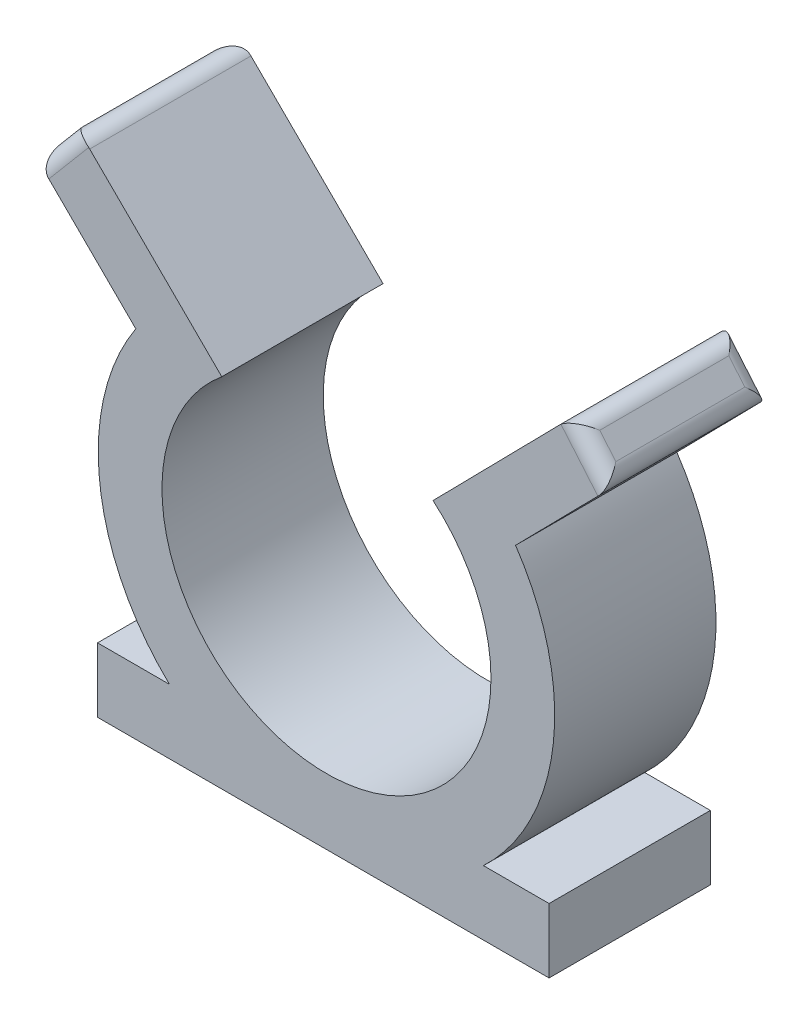
ISO-10303-21;
HEADER;
FILE_DESCRIPTION(('STEP AP214'),'2;1');
FILE_NAME('part.step','',(''),(''),'','','');
FILE_SCHEMA(('AUTOMOTIVE_DESIGN { 1 0 10303 214 1 1 1 1 }'));
ENDSEC;
DATA;
#1=APPLICATION_CONTEXT('core data for automotive mechanical design processes');
#2=APPLICATION_PROTOCOL_DEFINITION('international standard','automotive_design',2000,#1);
#3=PRODUCT_CONTEXT('',#1,'mechanical');
#4=PRODUCT('Part','Part','',(#3));
#5=PRODUCT_RELATED_PRODUCT_CATEGORY('part','',(#4));
#6=PRODUCT_DEFINITION_FORMATION('','',#4);
#7=PRODUCT_DEFINITION_CONTEXT('part definition',#1,'design');
#8=PRODUCT_DEFINITION('design','',#6,#7);
#9=PRODUCT_DEFINITION_SHAPE('','',#8);
#10=(LENGTH_UNIT() NAMED_UNIT(*) SI_UNIT(.MILLI.,.METRE.));
#11=(NAMED_UNIT(*) PLANE_ANGLE_UNIT() SI_UNIT($,.RADIAN.));
#12=(NAMED_UNIT(*) SI_UNIT($,.STERADIAN.) SOLID_ANGLE_UNIT());
#13=UNCERTAINTY_MEASURE_WITH_UNIT(LENGTH_MEASURE(1.E-05),#10,'distance_accuracy_value','');
#14=(GEOMETRIC_REPRESENTATION_CONTEXT(3) GLOBAL_UNCERTAINTY_ASSIGNED_CONTEXT((#13)) GLOBAL_UNIT_ASSIGNED_CONTEXT((#10,
#11,#12)) REPRESENTATION_CONTEXT('',''));
#15=CARTESIAN_POINT('',(0.,0.,0.));
#16=DIRECTION('',(0.,0.,1.));
#17=DIRECTION('',(1.,0.,0.));
#18=AXIS2_PLACEMENT_3D('',#15,#16,#17);
#19=CARTESIAN_POINT('',(0.,4.,0.));
#20=DIRECTION('',(0.,1.,0.));
#21=DIRECTION('',(0.,0.,1.));
#22=AXIS2_PLACEMENT_3D('',#19,#20,#21);
#23=PLANE('',#22);
#24=DIRECTION('',(-1.,0.,0.));
#25=VECTOR('',#24,1.);
#26=CARTESIAN_POINT('',(-14.,4.,-5.));
#27=LINE('',#26,#25);
#28=CARTESIAN_POINT('',(14.,4.,-5.));
#29=VERTEX_POINT('',#28);
#30=CARTESIAN_POINT('',(9.92946613478916,4.,-5.));
#31=VERTEX_POINT('',#30);
#32=EDGE_CURVE('E243',#29,#31,#27,.T.);
#33=ORIENTED_EDGE('',*,*,#32,.T.);
#34=DIRECTION('',(0.,0.,-1.));
#35=VECTOR('',#34,1.);
#36=CARTESIAN_POINT('',(9.92946613478916,4.,5.));
#37=LINE('',#36,#35);
#38=CARTESIAN_POINT('',(9.92946613478916,4.,5.));
#39=VERTEX_POINT('',#38);
#40=EDGE_CURVE('E279',#31,#39,#37,.F.);
#41=ORIENTED_EDGE('',*,*,#40,.T.);
#42=DIRECTION('',(1.,0.,0.));
#43=VECTOR('',#42,1.);
#44=CARTESIAN_POINT('',(-14.,4.,5.));
#45=LINE('',#44,#43);
#46=CARTESIAN_POINT('',(14.,4.,5.));
#47=VERTEX_POINT('',#46);
#48=EDGE_CURVE('E200',#39,#47,#45,.T.);
#49=ORIENTED_EDGE('',*,*,#48,.T.);
#50=DIRECTION('',(0.,0.,-1.));
#51=VECTOR('',#50,1.);
#52=CARTESIAN_POINT('',(14.,4.,-5.));
#53=LINE('',#52,#51);
#54=EDGE_CURVE('E237',#47,#29,#53,.T.);
#55=ORIENTED_EDGE('',*,*,#54,.T.);
#56=EDGE_LOOP('',(#33,#41,#49,#55));
#57=FACE_BOUND('',#56,.T.);
#58=ADVANCED_FACE('F45',(#57),#23,.T.);
#59=CARTESIAN_POINT('',(-14.,4.,5.));
#60=VERTEX_POINT('',#59);
#61=CARTESIAN_POINT('',(-9.53690683923491,4.,5.));
#62=VERTEX_POINT('',#61);
#63=EDGE_CURVE('E249',#60,#62,#45,.T.);
#64=ORIENTED_EDGE('',*,*,#63,.T.);
#65=DIRECTION('',(0.,0.,-1.));
#66=VECTOR('',#65,1.);
#67=CARTESIAN_POINT('',(-9.53690683923491,4.,5.));
#68=LINE('',#67,#66);
#69=CARTESIAN_POINT('',(-9.53690683923491,4.,-5.));
#70=VERTEX_POINT('',#69);
#71=EDGE_CURVE('E275',#62,#70,#68,.T.);
#72=ORIENTED_EDGE('',*,*,#71,.T.);
#73=CARTESIAN_POINT('',(-14.,4.,-5.));
#74=VERTEX_POINT('',#73);
#75=EDGE_CURVE('E241',#70,#74,#27,.T.);
#76=ORIENTED_EDGE('',*,*,#75,.T.);
#77=DIRECTION('',(0.,0.,1.));
#78=VECTOR('',#77,1.);
#79=CARTESIAN_POINT('',(-14.,4.,-5.));
#80=LINE('',#79,#78);
#81=EDGE_CURVE('E246',#74,#60,#80,.T.);
#82=ORIENTED_EDGE('',*,*,#81,.T.);
#83=EDGE_LOOP('',(#64,#72,#76,#82));
#84=FACE_BOUND('',#83,.T.);
#85=ADVANCED_FACE('F485',(#84),#23,.T.);
#86=CARTESIAN_POINT('',(14.,4.,-5.));
#87=DIRECTION('',(-1.,0.,0.));
#88=DIRECTION('',(0.,0.,1.));
#89=AXIS2_PLACEMENT_3D('',#86,#87,#88);
#90=PLANE('',#89);
#91=DIRECTION('',(0.,0.,-1.));
#92=VECTOR('',#91,1.);
#93=CARTESIAN_POINT('',(14.,0.,-5.));
#94=LINE('',#93,#92);
#95=CARTESIAN_POINT('',(14.,0.,5.));
#96=VERTEX_POINT('',#95);
#97=CARTESIAN_POINT('',(14.,0.,-5.));
#98=VERTEX_POINT('',#97);
#99=EDGE_CURVE('E224',#96,#98,#94,.T.);
#100=ORIENTED_EDGE('',*,*,#99,.T.);
#101=DIRECTION('',(0.,-1.,0.));
#102=VECTOR('',#101,1.);
#103=CARTESIAN_POINT('',(14.,4.,-5.));
#104=LINE('',#103,#102);
#105=EDGE_CURVE('E271',#29,#98,#104,.T.);
#106=ORIENTED_EDGE('',*,*,#105,.F.);
#107=ORIENTED_EDGE('',*,*,#54,.F.);
#108=DIRECTION('',(0.,-1.,0.));
#109=VECTOR('',#108,1.);
#110=CARTESIAN_POINT('',(14.,4.,5.));
#111=LINE('',#110,#109);
#112=EDGE_CURVE('E251',#47,#96,#111,.T.);
#113=ORIENTED_EDGE('',*,*,#112,.T.);
#114=EDGE_LOOP('',(#100,#106,#107,#113));
#115=FACE_BOUND('',#114,.T.);
#116=ADVANCED_FACE('F498',(#115),#90,.F.);
#117=CARTESIAN_POINT('',(-14.,4.,-5.));
#118=DIRECTION('',(0.,0.,1.));
#119=DIRECTION('',(1.,0.,0.));
#120=AXIS2_PLACEMENT_3D('',#117,#118,#119);
#121=PLANE('',#120);
#122=DIRECTION('',(-0.700951360204285,-0.713209079182089,0.));
#123=VECTOR('',#122,1.);
#124=CARTESIAN_POINT('',(6.80491649208156,22.0430990957473,-5.));
#125=LINE('',#124,#123);
#126=CARTESIAN_POINT('',(14.6659619702366,30.041612723354,-5.));
#127=VERTEX_POINT('',#126);
#128=CARTESIAN_POINT('',(6.80491649208156,22.0430990957473,-5.));
#129=VERTEX_POINT('',#128);
#130=EDGE_CURVE('E444',#127,#129,#125,.T.);
#131=ORIENTED_EDGE('',*,*,#130,.F.);
#132=CARTESIAN_POINT('',(15.3791710494186,29.3406613631497,-5.));
#133=DIRECTION('',(0.,0.,1.));
#134=DIRECTION('',(1.,0.,0.));
#135=AXIS2_PLACEMENT_3D('',#132,#133,#134);
#136=CIRCLE('',#135,1.);
#137=CARTESIAN_POINT('',(14.7337759285726,30.1045102605033,-5.));
#138=VERTEX_POINT('',#137);
#139=EDGE_CURVE('E327',#127,#138,#136,.F.);
#140=ORIENTED_EDGE('',*,*,#139,.T.);
#141=DIRECTION('',(-0.645395120845996,0.763848897353516,0.));
#142=VECTOR('',#141,1.);
#143=CARTESIAN_POINT('',(15.634271596881,29.038740469112,-5.));
#144=LINE('',#143,#142);
#145=CARTESIAN_POINT('',(17.0259782087913,27.3916044331999,-5.));
#146=VERTEX_POINT('',#145);
#147=EDGE_CURVE('E324',#138,#146,#144,.F.);
#148=ORIENTED_EDGE('',*,*,#147,.T.);
#149=DIRECTION('',(0.700951360204285,0.713209079182089,0.));
#150=VECTOR('',#149,1.);
#151=CARTESIAN_POINT('',(11.9216304084356,22.197995573584,-5.));
#152=LINE('',#151,#150);
#153=CARTESIAN_POINT('',(11.9216304084356,22.197995573584,-5.));
#154=VERTEX_POINT('',#153);
#155=EDGE_CURVE('E441',#154,#146,#152,.T.);
#156=ORIENTED_EDGE('',*,*,#155,.F.);
#157=CARTESIAN_POINT('',(0.196279647777124,14.2735483326657,-5.));
#158=DIRECTION('',(0.,0.,1.));
#159=DIRECTION('',(1.,0.,0.));
#160=AXIS2_PLACEMENT_3D('',#157,#158,#159);
#161=CIRCLE('',#160,14.1520569011918);
#162=EDGE_CURVE('E221',#31,#154,#161,.T.);
#163=ORIENTED_EDGE('',*,*,#162,.F.);
#164=ORIENTED_EDGE('',*,*,#32,.F.);
#165=ORIENTED_EDGE('',*,*,#105,.T.);
#166=DIRECTION('',(-1.,0.,0.));
#167=VECTOR('',#166,1.);
#168=CARTESIAN_POINT('',(-14.,0.,-5.));
#169=LINE('',#168,#167);
#170=CARTESIAN_POINT('',(-14.,0.,-5.));
#171=VERTEX_POINT('',#170);
#172=EDGE_CURVE('E230',#98,#171,#169,.T.);
#173=ORIENTED_EDGE('',*,*,#172,.T.);
#174=DIRECTION('',(0.,-1.,0.));
#175=VECTOR('',#174,1.);
#176=CARTESIAN_POINT('',(-14.,4.,-5.));
#177=LINE('',#176,#175);
#178=EDGE_CURVE('E267',#74,#171,#177,.T.);
#179=ORIENTED_EDGE('',*,*,#178,.F.);
#180=ORIENTED_EDGE('',*,*,#75,.F.);
#181=CARTESIAN_POINT('',(-11.6276237366179,22.0501814917561,-5.));
#182=VERTEX_POINT('',#181);
#183=EDGE_CURVE('E400',#182,#70,#161,.T.);
#184=ORIENTED_EDGE('',*,*,#183,.F.);
#185=DIRECTION('',(0.709696730738162,-0.704507310380499,0.));
#186=VECTOR('',#185,1.);
#187=CARTESIAN_POINT('',(-11.6276237366179,22.0501814917561,-5.));
#188=LINE('',#187,#186);
#189=CARTESIAN_POINT('',(-17.0179561205549,27.4010988701052,-5.));
#190=VERTEX_POINT('',#189);
#191=EDGE_CURVE('E206',#190,#182,#188,.T.);
#192=ORIENTED_EDGE('',*,*,#191,.F.);
#193=DIRECTION('',(-0.645395120845996,-0.763848897353516,0.));
#194=VECTOR('',#193,1.);
#195=CARTESIAN_POINT('',(-27.2972477332119,15.2351786294765,-5.));
#196=LINE('',#195,#194);
#197=CARTESIAN_POINT('',(-14.5457717820458,30.3270200926727,-5.));
#198=VERTEX_POINT('',#197);
#199=EDGE_CURVE('E318',#190,#198,#196,.F.);
#200=ORIENTED_EDGE('',*,*,#199,.T.);
#201=CARTESIAN_POINT('',(-15.1911669028918,29.5631711953191,-5.));
#202=DIRECTION('',(0.,0.,1.));
#203=DIRECTION('',(1.,0.,0.));
#204=AXIS2_PLACEMENT_3D('',#201,#202,#203);
#205=CIRCLE('',#204,1.);
#206=CARTESIAN_POINT('',(-14.4866595925113,30.2728679260573,-5.));
#207=VERTEX_POINT('',#206);
#208=EDGE_CURVE('E321',#198,#207,#205,.F.);
#209=ORIENTED_EDGE('',*,*,#208,.T.);
#210=DIRECTION('',(-0.709696730738162,0.704507310380499,0.));
#211=VECTOR('',#210,1.);
#212=CARTESIAN_POINT('',(-6.29516807483853,22.1412739547593,-5.));
#213=LINE('',#212,#211);
#214=CARTESIAN_POINT('',(-6.29516807483853,22.1412739547593,-5.));
#215=VERTEX_POINT('',#214);
#216=EDGE_CURVE('E402',#215,#207,#213,.T.);
#217=ORIENTED_EDGE('',*,*,#216,.F.);
#218=CARTESIAN_POINT('',(0.196279647777124,14.2735483326657,-5.));
#219=DIRECTION('',(0.,0.,-1.));
#220=DIRECTION('',(1.,0.,0.));
#221=AXIS2_PLACEMENT_3D('',#218,#219,#220);
#222=CIRCLE('',#221,10.2);
#223=EDGE_CURVE('E406',#129,#215,#222,.T.);
#224=ORIENTED_EDGE('',*,*,#223,.F.);
#225=EDGE_LOOP('',(#131,#140,#148,#156,#163,#164,#165,#173,#179,#180,#184,#192,#200,#209,#217,#224));
#226=FACE_BOUND('',#225,.T.);
#227=ADVANCED_FACE('F398',(#226),#121,.F.);
#228=CARTESIAN_POINT('',(-14.,4.,-5.));
#229=DIRECTION('',(1.,0.,0.));
#230=DIRECTION('',(0.,0.,-1.));
#231=AXIS2_PLACEMENT_3D('',#228,#229,#230);
#232=PLANE('',#231);
#233=DIRECTION('',(0.,0.,1.));
#234=VECTOR('',#233,1.);
#235=CARTESIAN_POINT('',(-14.,0.,-5.));
#236=LINE('',#235,#234);
#237=CARTESIAN_POINT('',(-14.,0.,5.));
#238=VERTEX_POINT('',#237);
#239=EDGE_CURVE('E255',#171,#238,#236,.T.);
#240=ORIENTED_EDGE('',*,*,#239,.T.);
#241=DIRECTION('',(0.,-1.,0.));
#242=VECTOR('',#241,1.);
#243=CARTESIAN_POINT('',(-14.,4.,5.));
#244=LINE('',#243,#242);
#245=EDGE_CURVE('E263',#60,#238,#244,.T.);
#246=ORIENTED_EDGE('',*,*,#245,.F.);
#247=ORIENTED_EDGE('',*,*,#81,.F.);
#248=ORIENTED_EDGE('',*,*,#178,.T.);
#249=EDGE_LOOP('',(#240,#246,#247,#248));
#250=FACE_BOUND('',#249,.T.);
#251=ADVANCED_FACE('F490',(#250),#232,.F.);
#252=CARTESIAN_POINT('',(-14.,4.,5.));
#253=DIRECTION('',(0.,0.,-1.));
#254=DIRECTION('',(-1.,0.,0.));
#255=AXIS2_PLACEMENT_3D('',#252,#253,#254);
#256=PLANE('',#255);
#257=DIRECTION('',(0.700951360204285,0.713209079182089,0.));
#258=VECTOR('',#257,1.);
#259=CARTESIAN_POINT('',(11.9216304084356,22.197995573584,5.));
#260=LINE('',#259,#258);
#261=CARTESIAN_POINT('',(11.9216304084356,22.197995573584,5.));
#262=VERTEX_POINT('',#261);
#263=CARTESIAN_POINT('',(17.0259782087913,27.3916044331999,5.));
#264=VERTEX_POINT('',#263);
#265=EDGE_CURVE('E197',#262,#264,#260,.T.);
#266=ORIENTED_EDGE('',*,*,#265,.T.);
#267=DIRECTION('',(-0.645395120845996,0.763848897353516,0.));
#268=VECTOR('',#267,1.);
#269=CARTESIAN_POINT('',(15.634271596881,29.038740469112,5.));
#270=LINE('',#269,#268);
#271=CARTESIAN_POINT('',(14.7337759285726,30.1045102605033,5.));
#272=VERTEX_POINT('',#271);
#273=EDGE_CURVE('E312',#264,#272,#270,.T.);
#274=ORIENTED_EDGE('',*,*,#273,.T.);
#275=CARTESIAN_POINT('',(15.3791710494186,29.3406613631497,5.));
#276=DIRECTION('',(0.,0.,-1.));
#277=DIRECTION('',(-1.,0.,0.));
#278=AXIS2_PLACEMENT_3D('',#275,#276,#277);
#279=CIRCLE('',#278,1.);
#280=CARTESIAN_POINT('',(14.6659619702366,30.041612723354,5.));
#281=VERTEX_POINT('',#280);
#282=EDGE_CURVE('E309',#272,#281,#279,.F.);
#283=ORIENTED_EDGE('',*,*,#282,.T.);
#284=DIRECTION('',(-0.700951360204285,-0.713209079182089,0.));
#285=VECTOR('',#284,1.);
#286=CARTESIAN_POINT('',(6.80491649208156,22.0430990957473,5.));
#287=LINE('',#286,#285);
#288=CARTESIAN_POINT('',(6.80491649208156,22.0430990957473,5.));
#289=VERTEX_POINT('',#288);
#290=EDGE_CURVE('E217',#281,#289,#287,.T.);
#291=ORIENTED_EDGE('',*,*,#290,.T.);
#292=CARTESIAN_POINT('',(0.196279647777124,14.2735483326657,5.));
#293=DIRECTION('',(0.,0.,-1.));
#294=DIRECTION('',(1.,0.,0.));
#295=AXIS2_PLACEMENT_3D('',#292,#293,#294);
#296=CIRCLE('',#295,10.2);
#297=CARTESIAN_POINT('',(-6.29516807483853,22.1412739547593,5.));
#298=VERTEX_POINT('',#297);
#299=EDGE_CURVE('E430',#289,#298,#296,.T.);
#300=ORIENTED_EDGE('',*,*,#299,.T.);
#301=DIRECTION('',(-0.709696730738162,0.704507310380499,0.));
#302=VECTOR('',#301,1.);
#303=CARTESIAN_POINT('',(-6.29516807483853,22.1412739547593,5.));
#304=LINE('',#303,#302);
#305=CARTESIAN_POINT('',(-14.4866595925113,30.2728679260573,5.));
#306=VERTEX_POINT('',#305);
#307=EDGE_CURVE('E422',#298,#306,#304,.T.);
#308=ORIENTED_EDGE('',*,*,#307,.T.);
#309=CARTESIAN_POINT('',(-15.1911669028918,29.5631711953191,5.));
#310=DIRECTION('',(0.,0.,-1.));
#311=DIRECTION('',(-1.,0.,0.));
#312=AXIS2_PLACEMENT_3D('',#309,#310,#311);
#313=CIRCLE('',#312,1.);
#314=CARTESIAN_POINT('',(-14.5457717820458,30.3270200926727,5.));
#315=VERTEX_POINT('',#314);
#316=EDGE_CURVE('E306',#306,#315,#313,.F.);
#317=ORIENTED_EDGE('',*,*,#316,.T.);
#318=DIRECTION('',(-0.645395120845996,-0.763848897353516,0.));
#319=VECTOR('',#318,1.);
#320=CARTESIAN_POINT('',(-27.2972477332119,15.2351786294765,5.));
#321=LINE('',#320,#319);
#322=CARTESIAN_POINT('',(-17.0179561205549,27.4010988701052,5.));
#323=VERTEX_POINT('',#322);
#324=EDGE_CURVE('E303',#315,#323,#321,.T.);
#325=ORIENTED_EDGE('',*,*,#324,.T.);
#326=DIRECTION('',(0.709696730738162,-0.704507310380499,0.));
#327=VECTOR('',#326,1.);
#328=CARTESIAN_POINT('',(-11.6276237366179,22.0501814917561,5.));
#329=LINE('',#328,#327);
#330=CARTESIAN_POINT('',(-11.6276237366179,22.0501814917561,5.));
#331=VERTEX_POINT('',#330);
#332=EDGE_CURVE('E412',#323,#331,#329,.T.);
#333=ORIENTED_EDGE('',*,*,#332,.T.);
#334=CARTESIAN_POINT('',(0.196279647777124,14.2735483326657,5.));
#335=DIRECTION('',(0.,0.,1.));
#336=DIRECTION('',(1.,0.,0.));
#337=AXIS2_PLACEMENT_3D('',#334,#335,#336);
#338=CIRCLE('',#337,14.1520569011918);
#339=EDGE_CURVE('E205',#331,#62,#338,.T.);
#340=ORIENTED_EDGE('',*,*,#339,.T.);
#341=ORIENTED_EDGE('',*,*,#63,.F.);
#342=ORIENTED_EDGE('',*,*,#245,.T.);
#343=DIRECTION('',(1.,0.,0.));
#344=VECTOR('',#343,1.);
#345=CARTESIAN_POINT('',(-14.,0.,5.));
#346=LINE('',#345,#344);
#347=EDGE_CURVE('E242',#238,#96,#346,.T.);
#348=ORIENTED_EDGE('',*,*,#347,.T.);
#349=ORIENTED_EDGE('',*,*,#112,.F.);
#350=ORIENTED_EDGE('',*,*,#48,.F.);
#351=EDGE_CURVE('E194',#39,#262,#338,.T.);
#352=ORIENTED_EDGE('',*,*,#351,.T.);
#353=EDGE_LOOP('',(#266,#274,#283,#291,#300,#308,#317,#325,#333,#340,#341,#342,#348,#349,#350,#352));
#354=FACE_BOUND('',#353,.T.);
#355=ADVANCED_FACE('F196',(#354),#256,.F.);
#356=CARTESIAN_POINT('',(0.,0.,0.));
#357=DIRECTION('',(0.,1.,0.));
#358=DIRECTION('',(0.,0.,1.));
#359=AXIS2_PLACEMENT_3D('',#356,#357,#358);
#360=PLANE('',#359);
#361=ORIENTED_EDGE('',*,*,#99,.F.);
#362=ORIENTED_EDGE('',*,*,#347,.F.);
#363=ORIENTED_EDGE('',*,*,#239,.F.);
#364=ORIENTED_EDGE('',*,*,#172,.F.);
#365=EDGE_LOOP('',(#361,#362,#363,#364));
#366=FACE_BOUND('',#365,.T.);
#367=ADVANCED_FACE('F495',(#366),#360,.F.);
#368=CARTESIAN_POINT('',(0.196279647777124,14.2735483326657,5.));
#369=DIRECTION('',(0.,0.,-1.));
#370=DIRECTION('',(-1.,0.,0.));
#371=AXIS2_PLACEMENT_3D('',#368,#369,#370);
#372=CYLINDRICAL_SURFACE('',#371,14.1520569011918);
#373=ORIENTED_EDGE('',*,*,#40,.F.);
#374=ORIENTED_EDGE('',*,*,#162,.T.);
#375=DIRECTION('',(0.,0.,-1.));
#376=VECTOR('',#375,1.);
#377=CARTESIAN_POINT('',(11.9216304084356,22.197995573584,5.));
#378=LINE('',#377,#376);
#379=EDGE_CURVE('E213',#262,#154,#378,.T.);
#380=ORIENTED_EDGE('',*,*,#379,.F.);
#381=ORIENTED_EDGE('',*,*,#351,.F.);
#382=EDGE_LOOP('',(#373,#374,#380,#381));
#383=FACE_BOUND('',#382,.T.);
#384=ADVANCED_FACE('F219',(#383),#372,.T.);
#385=ORIENTED_EDGE('',*,*,#71,.F.);
#386=ORIENTED_EDGE('',*,*,#339,.F.);
#387=DIRECTION('',(0.,0.,-1.));
#388=VECTOR('',#387,1.);
#389=CARTESIAN_POINT('',(-11.6276237366179,22.0501814917561,5.));
#390=LINE('',#389,#388);
#391=EDGE_CURVE('E410',#331,#182,#390,.T.);
#392=ORIENTED_EDGE('',*,*,#391,.T.);
#393=ORIENTED_EDGE('',*,*,#183,.T.);
#394=EDGE_LOOP('',(#385,#386,#392,#393));
#395=FACE_BOUND('',#394,.T.);
#396=ADVANCED_FACE('F483',(#395),#372,.T.);
#397=CARTESIAN_POINT('',(11.9216304084356,22.197995573584,5.));
#398=DIRECTION('',(-0.713209079182089,0.700951360204285,0.));
#399=DIRECTION('',(-0.700951360204285,-0.713209079182089,0.));
#400=AXIS2_PLACEMENT_3D('',#397,#398,#399);
#401=PLANE('',#400);
#402=DIRECTION('',(0.,0.,-1.));
#403=VECTOR('',#402,1.);
#404=CARTESIAN_POINT('',(17.0910196842842,27.4577833059129,5.));
#405=LINE('',#404,#403);
#406=CARTESIAN_POINT('',(17.0910196842842,27.4577833059129,-4.99572258343768));
#407=VERTEX_POINT('',#406);
#408=CARTESIAN_POINT('',(17.0910196842842,27.4577833059129,4.99572258343768));
#409=VERTEX_POINT('',#408);
#410=EDGE_CURVE('E298',#407,#409,#405,.F.);
#411=ORIENTED_EDGE('',*,*,#410,.T.);
#412=CARTESIAN_POINT('',(17.0259782087913,27.3916044331999,4.));
#413=DIRECTION('',(-0.713209079182089,0.700951360204285,0.));
#414=DIRECTION('',(0.700951360204285,0.713209079182089,0.));
#415=AXIS2_PLACEMENT_3D('',#412,#413,#414);
#416=ELLIPSE('',#415,1.00429579145183,1.);
#417=EDGE_CURVE('E215',#409,#264,#416,.F.);
#418=ORIENTED_EDGE('',*,*,#417,.T.);
#419=ORIENTED_EDGE('',*,*,#265,.F.);
#420=ORIENTED_EDGE('',*,*,#379,.T.);
#421=ORIENTED_EDGE('',*,*,#155,.T.);
#422=CARTESIAN_POINT('',(17.0259782087913,27.3916044331999,-4.));
#423=DIRECTION('',(-0.713209079182089,0.700951360204285,0.));
#424=DIRECTION('',(0.700951360204285,0.713209079182089,0.));
#425=AXIS2_PLACEMENT_3D('',#422,#423,#424);
#426=ELLIPSE('',#425,1.00429579145183,1.);
#427=EDGE_CURVE('E295',#146,#407,#426,.F.);
#428=ORIENTED_EDGE('',*,*,#427,.T.);
#429=EDGE_LOOP('',(#411,#418,#419,#420,#421,#428));
#430=FACE_BOUND('',#429,.T.);
#431=ADVANCED_FACE('F211',(#430),#401,.F.);
#432=CARTESIAN_POINT('',(15.4349659467951,30.8240644727148,5.));
#433=DIRECTION('',(-0.763848897353516,-0.645395120845996,0.));
#434=DIRECTION('',(0.645395120845996,-0.763848897353516,0.));
#435=AXIS2_PLACEMENT_3D('',#432,#433,#434);
#436=PLANE('',#435);
#437=DIRECTION('',(-0.645395120845996,0.763848897353516,0.));
#438=VECTOR('',#437,1.);
#439=CARTESIAN_POINT('',(15.4349659467951,30.8240644727148,4.));
#440=LINE('',#439,#438);
#441=CARTESIAN_POINT('',(16.1430199467722,29.9860564839957,4.));
#442=VERTEX_POINT('',#441);
#443=CARTESIAN_POINT('',(17.1416595024556,28.8041297869632,4.));
#444=VERTEX_POINT('',#443);
#445=EDGE_CURVE('E288',#442,#444,#440,.F.);
#446=ORIENTED_EDGE('',*,*,#445,.T.);
#447=DIRECTION('',(0.,0.,-1.));
#448=VECTOR('',#447,1.);
#449=CARTESIAN_POINT('',(17.1416595024556,28.8041297869632,5.));
#450=LINE('',#449,#448);
#451=CARTESIAN_POINT('',(17.1416595024556,28.8041297869632,-4.));
#452=VERTEX_POINT('',#451);
#453=EDGE_CURVE('E291',#444,#452,#450,.T.);
#454=ORIENTED_EDGE('',*,*,#453,.T.);
#455=DIRECTION('',(-0.645395120845996,0.763848897353516,0.));
#456=VECTOR('',#455,1.);
#457=CARTESIAN_POINT('',(15.4349659467951,30.8240644727148,-4.));
#458=LINE('',#457,#456);
#459=CARTESIAN_POINT('',(16.1430199467722,29.9860564839957,-4.));
#460=VERTEX_POINT('',#459);
#461=EDGE_CURVE('E282',#452,#460,#458,.T.);
#462=ORIENTED_EDGE('',*,*,#461,.T.);
#463=DIRECTION('',(0.,0.,-1.));
#464=VECTOR('',#463,1.);
#465=CARTESIAN_POINT('',(16.1430199467722,29.9860564839957,5.));
#466=LINE('',#465,#464);
#467=EDGE_CURVE('E285',#460,#442,#466,.F.);
#468=ORIENTED_EDGE('',*,*,#467,.T.);
#469=EDGE_LOOP('',(#446,#454,#462,#468));
#470=FACE_BOUND('',#469,.T.);
#471=ADVANCED_FACE('F472',(#470),#436,.F.);
#472=CARTESIAN_POINT('',(6.80491649208156,22.0430990957473,5.));
#473=DIRECTION('',(0.713209079182089,-0.700951360204285,0.));
#474=DIRECTION('',(0.700951360204285,0.713209079182089,0.));
#475=AXIS2_PLACEMENT_3D('',#472,#473,#474);
#476=PLANE('',#475);
#477=ORIENTED_EDGE('',*,*,#290,.F.);
#478=DIRECTION('',(0.,0.,-1.));
#479=VECTOR('',#478,1.);
#480=CARTESIAN_POINT('',(14.6659619702366,30.041612723354,5.));
#481=LINE('',#480,#479);
#482=EDGE_CURVE('E315',#281,#127,#481,.T.);
#483=ORIENTED_EDGE('',*,*,#482,.T.);
#484=ORIENTED_EDGE('',*,*,#130,.T.);
#485=DIRECTION('',(0.,0.,-1.));
#486=VECTOR('',#485,1.);
#487=CARTESIAN_POINT('',(6.80491649208156,22.0430990957473,5.));
#488=LINE('',#487,#486);
#489=EDGE_CURVE('E225',#289,#129,#488,.T.);
#490=ORIENTED_EDGE('',*,*,#489,.F.);
#491=EDGE_LOOP('',(#477,#483,#484,#490));
#492=FACE_BOUND('',#491,.T.);
#493=ADVANCED_FACE('F451',(#492),#476,.F.);
#494=CARTESIAN_POINT('',(0.196279647777124,14.2735483326657,5.));
#495=DIRECTION('',(0.,0.,-1.));
#496=DIRECTION('',(-1.,0.,0.));
#497=AXIS2_PLACEMENT_3D('',#494,#495,#496);
#498=CYLINDRICAL_SURFACE('',#497,10.2);
#499=ORIENTED_EDGE('',*,*,#223,.T.);
#500=DIRECTION('',(0.,0.,-1.));
#501=VECTOR('',#500,1.);
#502=CARTESIAN_POINT('',(-6.29516807483853,22.1412739547593,5.));
#503=LINE('',#502,#501);
#504=EDGE_CURVE('E233',#298,#215,#503,.T.);
#505=ORIENTED_EDGE('',*,*,#504,.F.);
#506=ORIENTED_EDGE('',*,*,#299,.F.);
#507=ORIENTED_EDGE('',*,*,#489,.T.);
#508=EDGE_LOOP('',(#499,#505,#506,#507));
#509=FACE_BOUND('',#508,.T.);
#510=ADVANCED_FACE('F447',(#509),#498,.F.);
#511=CARTESIAN_POINT('',(-6.29516807483853,22.1412739547593,5.));
#512=DIRECTION('',(-0.704507310380499,-0.709696730738162,0.));
#513=DIRECTION('',(0.709696730738162,-0.704507310380499,0.));
#514=AXIS2_PLACEMENT_3D('',#511,#512,#513);
#515=PLANE('',#514);
#516=ORIENTED_EDGE('',*,*,#216,.T.);
#517=DIRECTION('',(0.,0.,-1.));
#518=VECTOR('',#517,1.);
#519=CARTESIAN_POINT('',(-14.4866595925113,30.2728679260573,5.));
#520=LINE('',#519,#518);
#521=EDGE_CURVE('E343',#207,#306,#520,.F.);
#522=ORIENTED_EDGE('',*,*,#521,.T.);
#523=ORIENTED_EDGE('',*,*,#307,.F.);
#524=ORIENTED_EDGE('',*,*,#504,.T.);
#525=EDGE_LOOP('',(#516,#522,#523,#524));
#526=FACE_BOUND('',#525,.T.);
#527=ADVANCED_FACE('F419',(#526),#515,.F.);
#528=CARTESIAN_POINT('',(-15.2556758027185,31.0362609620215,5.));
#529=DIRECTION('',(0.763848897353516,-0.645395120845996,0.));
#530=DIRECTION('',(0.645395120845996,0.763848897353516,0.));
#531=AXIS2_PLACEMENT_3D('',#528,#529,#530);
#532=PLANE('',#531);
#533=DIRECTION('',(-0.645395120845996,-0.763848897353516,0.));
#534=VECTOR('',#533,1.);
#535=CARTESIAN_POINT('',(-15.2556758027185,31.0362609620215,4.));
#536=LINE('',#535,#534);
#537=CARTESIAN_POINT('',(-17.1343293284332,28.812805317911,4.));
#538=VERTEX_POINT('',#537);
#539=CARTESIAN_POINT('',(-15.9550158002454,30.2085663161651,4.));
#540=VERTEX_POINT('',#539);
#541=EDGE_CURVE('E336',#538,#540,#536,.F.);
#542=ORIENTED_EDGE('',*,*,#541,.T.);
#543=DIRECTION('',(0.,0.,-1.));
#544=VECTOR('',#543,1.);
#545=CARTESIAN_POINT('',(-15.9550158002454,30.2085663161651,5.));
#546=LINE('',#545,#544);
#547=CARTESIAN_POINT('',(-15.9550158002454,30.2085663161651,-4.));
#548=VERTEX_POINT('',#547);
#549=EDGE_CURVE('E339',#540,#548,#546,.T.);
#550=ORIENTED_EDGE('',*,*,#549,.T.);
#551=DIRECTION('',(-0.645395120845996,-0.763848897353516,0.));
#552=VECTOR('',#551,1.);
#553=CARTESIAN_POINT('',(-15.2556758027185,31.0362609620215,-4.));
#554=LINE('',#553,#552);
#555=CARTESIAN_POINT('',(-17.1343293284332,28.812805317911,-4.));
#556=VERTEX_POINT('',#555);
#557=EDGE_CURVE('E330',#548,#556,#554,.T.);
#558=ORIENTED_EDGE('',*,*,#557,.T.);
#559=DIRECTION('',(0.,0.,-1.));
#560=VECTOR('',#559,1.);
#561=CARTESIAN_POINT('',(-17.1343293284332,28.812805317911,5.));
#562=LINE('',#561,#560);
#563=EDGE_CURVE('E333',#556,#538,#562,.F.);
#564=ORIENTED_EDGE('',*,*,#563,.T.);
#565=EDGE_LOOP('',(#542,#550,#558,#564));
#566=FACE_BOUND('',#565,.T.);
#567=ADVANCED_FACE('F566',(#566),#532,.F.);
#568=CARTESIAN_POINT('',(-11.6276237366179,22.0501814917561,5.));
#569=DIRECTION('',(0.704507310380499,0.709696730738162,0.));
#570=DIRECTION('',(-0.709696730738162,0.704507310380499,0.));
#571=AXIS2_PLACEMENT_3D('',#568,#569,#570);
#572=PLANE('',#571);
#573=ORIENTED_EDGE('',*,*,#332,.F.);
#574=CARTESIAN_POINT('',(-17.0179561205549,27.4010988701052,4.));
#575=DIRECTION('',(0.704507310380499,0.709696730738162,0.));
#576=DIRECTION('',(0.709696730738162,-0.704507310380499,0.));
#577=AXIS2_PLACEMENT_3D('',#574,#575,#576);
#578=ELLIPSE('',#577,1.00322371298152,1.);
#579=CARTESIAN_POINT('',(-17.0749877414601,27.4577134663269,4.99678664594965));
#580=VERTEX_POINT('',#579);
#581=EDGE_CURVE('E11',#323,#580,#578,.F.);
#582=ORIENTED_EDGE('',*,*,#581,.T.);
#583=DIRECTION('',(0.,0.,-1.));
#584=VECTOR('',#583,1.);
#585=CARTESIAN_POINT('',(-17.0749877414601,27.4577134663269,5.));
#586=LINE('',#585,#584);
#587=CARTESIAN_POINT('',(-17.0749877414601,27.4577134663269,-4.99678664594965));
#588=VERTEX_POINT('',#587);
#589=EDGE_CURVE('E55',#580,#588,#586,.T.);
#590=ORIENTED_EDGE('',*,*,#589,.T.);
#591=CARTESIAN_POINT('',(-17.0179561205549,27.4010988701052,-4.));
#592=DIRECTION('',(0.704507310380499,0.709696730738162,0.));
#593=DIRECTION('',(0.709696730738162,-0.704507310380499,0.));
#594=AXIS2_PLACEMENT_3D('',#591,#592,#593);
#595=ELLIPSE('',#594,1.00322371298152,1.);
#596=EDGE_CURVE('E347',#588,#190,#595,.F.);
#597=ORIENTED_EDGE('',*,*,#596,.T.);
#598=ORIENTED_EDGE('',*,*,#191,.T.);
#599=ORIENTED_EDGE('',*,*,#391,.F.);
#600=EDGE_LOOP('',(#573,#582,#590,#597,#598,#599));
#601=FACE_BOUND('',#600,.T.);
#602=ADVANCED_FACE('F392',(#601),#572,.F.);
#603=CARTESIAN_POINT('',(15.3791710494186,29.3406613631497,5.));
#604=DIRECTION('',(0.,0.,-1.));
#605=DIRECTION('',(-1.,0.,0.));
#606=AXIS2_PLACEMENT_3D('',#603,#604,#605);
#607=CYLINDRICAL_SURFACE('',#606,1.);
#608=ORIENTED_EDGE('',*,*,#482,.F.);
#609=ORIENTED_EDGE('',*,*,#282,.F.);
#610=CARTESIAN_POINT('',(15.3791710494186,29.3406613631497,4.));
#611=DIRECTION('',(-0.456363266494915,0.540122735120538,-0.707106781186547));
#612=DIRECTION('',(0.456363266494915,-0.540122735120538,-0.707106781186547));
#613=AXIS2_PLACEMENT_3D('',#610,#611,#612);
#614=ELLIPSE('',#613,1.41421356237309,1.);
#615=EDGE_CURVE('E362',#442,#272,#614,.F.);
#616=ORIENTED_EDGE('',*,*,#615,.F.);
#617=ORIENTED_EDGE('',*,*,#467,.F.);
#618=CARTESIAN_POINT('',(15.3791710494186,29.3406613631497,-4.));
#619=DIRECTION('',(-0.456363266494915,0.540122735120538,0.707106781186547));
#620=DIRECTION('',(-0.456363266494915,0.540122735120538,-0.707106781186547));
#621=AXIS2_PLACEMENT_3D('',#618,#619,#620);
#622=ELLIPSE('',#621,1.41421356237309,1.);
#623=EDGE_CURVE('E358',#138,#460,#622,.F.);
#624=ORIENTED_EDGE('',*,*,#623,.F.);
#625=ORIENTED_EDGE('',*,*,#139,.F.);
#626=EDGE_LOOP('',(#608,#609,#616,#617,#624,#625));
#627=FACE_BOUND('',#626,.T.);
#628=ADVANCED_FACE('F456',(#627),#607,.T.);
#629=CARTESIAN_POINT('',(15.634271596881,29.038740469112,4.));
#630=DIRECTION('',(-0.645395120845996,0.763848897353516,0.));
#631=DIRECTION('',(-0.763848897353516,-0.645395120845996,0.));
#632=AXIS2_PLACEMENT_3D('',#629,#630,#631);
#633=CYLINDRICAL_SURFACE('',#632,1.);
#634=ORIENTED_EDGE('',*,*,#273,.F.);
#635=ORIENTED_EDGE('',*,*,#417,.F.);
#636=CARTESIAN_POINT('',(16.3778106051021,28.1587346661172,4.));
#637=DIRECTION('',(-0.456363266494915,0.540122735120538,0.707106781186547));
#638=DIRECTION('',(-0.456363266494915,0.540122735120538,-0.707106781186547));
#639=AXIS2_PLACEMENT_3D('',#636,#637,#638);
#640=ELLIPSE('',#639,1.41421356237309,1.);
#641=EDGE_CURVE('E355',#444,#409,#640,.F.);
#642=ORIENTED_EDGE('',*,*,#641,.F.);
#643=ORIENTED_EDGE('',*,*,#445,.F.);
#644=ORIENTED_EDGE('',*,*,#615,.T.);
#645=EDGE_LOOP('',(#634,#635,#642,#643,#644));
#646=FACE_BOUND('',#645,.T.);
#647=ADVANCED_FACE('F475',(#646),#633,.T.);
#648=CARTESIAN_POINT('',(14.6711170494415,30.1786693518688,-4.));
#649=DIRECTION('',(-0.645395120845996,0.763848897353516,0.));
#650=DIRECTION('',(-0.763848897353516,-0.645395120845996,0.));
#651=AXIS2_PLACEMENT_3D('',#648,#649,#650);
#652=CYLINDRICAL_SURFACE('',#651,1.);
#653=ORIENTED_EDGE('',*,*,#623,.T.);
#654=ORIENTED_EDGE('',*,*,#461,.F.);
#655=CARTESIAN_POINT('',(16.3778106051021,28.1587346661172,-4.));
#656=DIRECTION('',(-0.456363266494915,0.540122735120538,-0.707106781186547));
#657=DIRECTION('',(-0.456363266494915,0.540122735120538,0.707106781186547));
#658=AXIS2_PLACEMENT_3D('',#655,#656,#657);
#659=ELLIPSE('',#658,1.41421356237309,1.);
#660=EDGE_CURVE('E352',#407,#452,#659,.F.);
#661=ORIENTED_EDGE('',*,*,#660,.F.);
#662=ORIENTED_EDGE('',*,*,#427,.F.);
#663=ORIENTED_EDGE('',*,*,#147,.F.);
#664=EDGE_LOOP('',(#653,#654,#661,#662,#663));
#665=FACE_BOUND('',#664,.T.);
#666=ADVANCED_FACE('F464',(#665),#652,.T.);
#667=CARTESIAN_POINT('',(16.3778106051021,28.1587346661172,5.));
#668=DIRECTION('',(0.,0.,-1.));
#669=DIRECTION('',(-1.,0.,0.));
#670=AXIS2_PLACEMENT_3D('',#667,#668,#669);
#671=CYLINDRICAL_SURFACE('',#670,1.);
#672=ORIENTED_EDGE('',*,*,#641,.T.);
#673=ORIENTED_EDGE('',*,*,#410,.F.);
#674=ORIENTED_EDGE('',*,*,#660,.T.);
#675=ORIENTED_EDGE('',*,*,#453,.F.);
#676=EDGE_LOOP('',(#672,#673,#674,#675));
#677=FACE_BOUND('',#676,.T.);
#678=ADVANCED_FACE('F468',(#677),#671,.T.);
#679=CARTESIAN_POINT('',(-16.3704804310796,28.167410197065,5.));
#680=DIRECTION('',(0.,0.,-1.));
#681=DIRECTION('',(-1.,0.,0.));
#682=AXIS2_PLACEMENT_3D('',#679,#680,#681);
#683=CYLINDRICAL_SURFACE('',#682,1.);
#684=CARTESIAN_POINT('',(-16.3704804310796,28.167410197065,-4.));
#685=DIRECTION('',(-0.456363266494915,-0.540122735120538,0.707106781186547));
#686=DIRECTION('',(-0.456363266494915,-0.540122735120538,-0.707106781186547));
#687=AXIS2_PLACEMENT_3D('',#684,#685,#686);
#688=ELLIPSE('',#687,1.41421356237309,1.);
#689=EDGE_CURVE('E372',#588,#556,#688,.F.);
#690=ORIENTED_EDGE('',*,*,#689,.F.);
#691=ORIENTED_EDGE('',*,*,#589,.F.);
#692=CARTESIAN_POINT('',(-16.3704804310796,28.167410197065,4.));
#693=DIRECTION('',(-0.456363266494915,-0.540122735120538,-0.707106781186547));
#694=DIRECTION('',(0.456363266494915,0.540122735120538,-0.707106781186547));
#695=AXIS2_PLACEMENT_3D('',#692,#693,#694);
#696=ELLIPSE('',#695,1.41421356237309,1.);
#697=EDGE_CURVE('E49',#538,#580,#696,.F.);
#698=ORIENTED_EDGE('',*,*,#697,.F.);
#699=ORIENTED_EDGE('',*,*,#563,.F.);
#700=EDGE_LOOP('',(#690,#691,#698,#699));
#701=FACE_BOUND('',#700,.T.);
#702=ADVANCED_FACE('F47',(#701),#683,.T.);
#703=CARTESIAN_POINT('',(-27.2972477332119,15.2351786294765,4.));
#704=DIRECTION('',(-0.645395120845996,-0.763848897353516,0.));
#705=DIRECTION('',(0.763848897353516,-0.645395120845996,0.));
#706=AXIS2_PLACEMENT_3D('',#703,#704,#705);
#707=CYLINDRICAL_SURFACE('',#706,1.);
#708=ORIENTED_EDGE('',*,*,#581,.F.);
#709=ORIENTED_EDGE('',*,*,#324,.F.);
#710=CARTESIAN_POINT('',(-15.1911669028918,29.5631711953191,4.));
#711=DIRECTION('',(-0.456363266494915,-0.540122735120538,0.707106781186547));
#712=DIRECTION('',(-0.456363266494915,-0.540122735120538,-0.707106781186547));
#713=AXIS2_PLACEMENT_3D('',#710,#711,#712);
#714=ELLIPSE('',#713,1.41421356237309,1.);
#715=EDGE_CURVE('E369',#540,#315,#714,.F.);
#716=ORIENTED_EDGE('',*,*,#715,.F.);
#717=ORIENTED_EDGE('',*,*,#541,.F.);
#718=ORIENTED_EDGE('',*,*,#697,.T.);
#719=EDGE_LOOP('',(#708,#709,#716,#717,#718));
#720=FACE_BOUND('',#719,.T.);
#721=ADVANCED_FACE('F383',(#720),#707,.T.);
#722=CARTESIAN_POINT('',(-14.491826905365,30.3908658411755,-4.));
#723=DIRECTION('',(-0.645395120845996,-0.763848897353516,0.));
#724=DIRECTION('',(0.763848897353516,-0.645395120845996,0.));
#725=AXIS2_PLACEMENT_3D('',#722,#723,#724);
#726=CYLINDRICAL_SURFACE('',#725,1.);
#727=ORIENTED_EDGE('',*,*,#689,.T.);
#728=ORIENTED_EDGE('',*,*,#557,.F.);
#729=CARTESIAN_POINT('',(-15.1911669028918,29.5631711953191,-4.));
#730=DIRECTION('',(-0.456363266494915,-0.540122735120538,-0.707106781186547));
#731=DIRECTION('',(-0.456363266494915,-0.540122735120538,0.707106781186547));
#732=AXIS2_PLACEMENT_3D('',#729,#730,#731);
#733=ELLIPSE('',#732,1.41421356237309,1.);
#734=EDGE_CURVE('E366',#198,#548,#733,.F.);
#735=ORIENTED_EDGE('',*,*,#734,.F.);
#736=ORIENTED_EDGE('',*,*,#199,.F.);
#737=ORIENTED_EDGE('',*,*,#596,.F.);
#738=EDGE_LOOP('',(#727,#728,#735,#736,#737));
#739=FACE_BOUND('',#738,.T.);
#740=ADVANCED_FACE('F389',(#739),#726,.T.);
#741=CARTESIAN_POINT('',(-15.1911669028918,29.5631711953191,5.));
#742=DIRECTION('',(0.,0.,-1.));
#743=DIRECTION('',(-1.,0.,0.));
#744=AXIS2_PLACEMENT_3D('',#741,#742,#743);
#745=CYLINDRICAL_SURFACE('',#744,1.);
#746=ORIENTED_EDGE('',*,*,#316,.F.);
#747=ORIENTED_EDGE('',*,*,#521,.F.);
#748=ORIENTED_EDGE('',*,*,#208,.F.);
#749=ORIENTED_EDGE('',*,*,#734,.T.);
#750=ORIENTED_EDGE('',*,*,#549,.F.);
#751=ORIENTED_EDGE('',*,*,#715,.T.);
#752=EDGE_LOOP('',(#746,#747,#748,#749,#750,#751));
#753=FACE_BOUND('',#752,.T.);
#754=ADVANCED_FACE('F428',(#753),#745,.T.);
#755=CLOSED_SHELL('',(#58,#85,#116,#227,#251,#355,#367,#384,#396,#431,#471,#493,#510,#527,#567,
#602,#628,#647,#666,#678,#702,#721,#740,#754));
#756=MANIFOLD_SOLID_BREP('B2',#755);
#757=ADVANCED_BREP_SHAPE_REPRESENTATION('',(#18,#756),#14);
#758=SHAPE_DEFINITION_REPRESENTATION(#9,#757);
ENDSEC;
END-ISO-10303-21;
